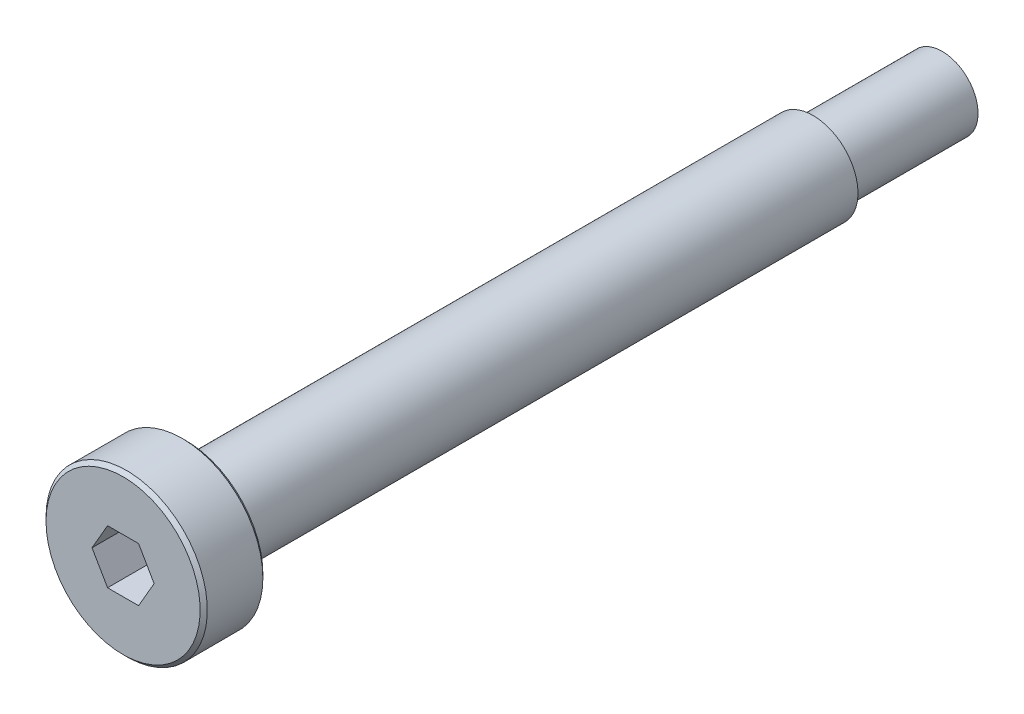
ISO-10303-21;
HEADER;
FILE_DESCRIPTION(('STEP AP214'),'2;1');
FILE_NAME('part.step','',(''),(''),'','','');
FILE_SCHEMA(('AUTOMOTIVE_DESIGN { 1 0 10303 214 1 1 1 1 }'));
ENDSEC;
DATA;
#1=APPLICATION_CONTEXT('core data for automotive mechanical design processes');
#2=APPLICATION_PROTOCOL_DEFINITION('international standard','automotive_design',2000,#1);
#3=PRODUCT_CONTEXT('',#1,'mechanical');
#4=PRODUCT('Part','Part','',(#3));
#5=PRODUCT_RELATED_PRODUCT_CATEGORY('part','',(#4));
#6=PRODUCT_DEFINITION_FORMATION('','',#4);
#7=PRODUCT_DEFINITION_CONTEXT('part definition',#1,'design');
#8=PRODUCT_DEFINITION('design','',#6,#7);
#9=PRODUCT_DEFINITION_SHAPE('','',#8);
#10=(LENGTH_UNIT() NAMED_UNIT(*) SI_UNIT(.MILLI.,.METRE.));
#11=(NAMED_UNIT(*) PLANE_ANGLE_UNIT() SI_UNIT($,.RADIAN.));
#12=(NAMED_UNIT(*) SI_UNIT($,.STERADIAN.) SOLID_ANGLE_UNIT());
#13=UNCERTAINTY_MEASURE_WITH_UNIT(LENGTH_MEASURE(1.E-05),#10,'distance_accuracy_value','');
#14=(GEOMETRIC_REPRESENTATION_CONTEXT(3) GLOBAL_UNCERTAINTY_ASSIGNED_CONTEXT((#13)) GLOBAL_UNIT_ASSIGNED_CONTEXT((#10,
#11,#12)) REPRESENTATION_CONTEXT('',''));
#15=CARTESIAN_POINT('',(0.,0.,0.));
#16=DIRECTION('',(0.,0.,1.));
#17=DIRECTION('',(1.,0.,0.));
#18=AXIS2_PLACEMENT_3D('',#15,#16,#17);
#19=CARTESIAN_POINT('',(0.,0.,0.));
#20=DIRECTION('',(0.,0.,-1.));
#21=DIRECTION('',(-1.,0.,0.));
#22=AXIS2_PLACEMENT_3D('',#19,#20,#21);
#23=PLANE('',#22);
#24=CARTESIAN_POINT('',(0.,0.,0.));
#25=DIRECTION('',(0.,0.,-1.));
#26=DIRECTION('',(-1.,0.,0.));
#27=AXIS2_PLACEMENT_3D('',#24,#25,#26);
#28=CIRCLE('',#27,4.29999999999999);
#29=CARTESIAN_POINT('',(-4.29999999999999,0.,0.));
#30=VERTEX_POINT('',#29);
#31=EDGE_CURVE('E11',#30,#30,#28,.F.);
#32=ORIENTED_EDGE('',*,*,#31,.T.);
#33=EDGE_LOOP('',(#32));
#34=FACE_BOUND('',#33,.T.);
#35=DIRECTION('',(-0.5,0.866025403784438,0.));
#36=VECTOR('',#35,1.);
#37=CARTESIAN_POINT('',(1.73205080756888,0.,0.));
#38=LINE('',#37,#36);
#39=CARTESIAN_POINT('',(1.73205080756888,0.,0.));
#40=VERTEX_POINT('',#39);
#41=CARTESIAN_POINT('',(0.866025403784438,1.5,0.));
#42=VERTEX_POINT('',#41);
#43=EDGE_CURVE('E140',#40,#42,#38,.T.);
#44=ORIENTED_EDGE('',*,*,#43,.F.);
#45=DIRECTION('',(0.5,0.866025403784439,0.));
#46=VECTOR('',#45,1.);
#47=CARTESIAN_POINT('',(0.86602540378444,-1.5,0.));
#48=LINE('',#47,#46);
#49=CARTESIAN_POINT('',(0.86602540378444,-1.5,0.));
#50=VERTEX_POINT('',#49);
#51=EDGE_CURVE('E66',#50,#40,#48,.T.);
#52=ORIENTED_EDGE('',*,*,#51,.F.);
#53=DIRECTION('',(1.,0.,0.));
#54=VECTOR('',#53,1.);
#55=CARTESIAN_POINT('',(-0.866025403784438,-1.5,0.));
#56=LINE('',#55,#54);
#57=CARTESIAN_POINT('',(-0.866025403784438,-1.5,0.));
#58=VERTEX_POINT('',#57);
#59=EDGE_CURVE('E149',#58,#50,#56,.T.);
#60=ORIENTED_EDGE('',*,*,#59,.F.);
#61=DIRECTION('',(0.5,-0.866025403784439,0.));
#62=VECTOR('',#61,1.);
#63=CARTESIAN_POINT('',(-1.73205080756888,0.,0.));
#64=LINE('',#63,#62);
#65=CARTESIAN_POINT('',(-1.73205080756888,0.,0.));
#66=VERTEX_POINT('',#65);
#67=EDGE_CURVE('E147',#66,#58,#64,.T.);
#68=ORIENTED_EDGE('',*,*,#67,.F.);
#69=DIRECTION('',(-0.5,-0.866025403784439,0.));
#70=VECTOR('',#69,1.);
#71=CARTESIAN_POINT('',(-0.866025403784439,1.5,0.));
#72=LINE('',#71,#70);
#73=CARTESIAN_POINT('',(-0.866025403784439,1.5,0.));
#74=VERTEX_POINT('',#73);
#75=EDGE_CURVE('E114',#74,#66,#72,.T.);
#76=ORIENTED_EDGE('',*,*,#75,.F.);
#77=DIRECTION('',(-1.,0.,0.));
#78=VECTOR('',#77,1.);
#79=CARTESIAN_POINT('',(0.866025403784438,1.5,0.));
#80=LINE('',#79,#78);
#81=EDGE_CURVE('E143',#42,#74,#80,.T.);
#82=ORIENTED_EDGE('',*,*,#81,.F.);
#83=EDGE_LOOP('',(#44,#52,#60,#68,#76,#82));
#84=FACE_BOUND('',#83,.T.);
#85=ADVANCED_FACE('F50',(#34,#84),#23,.F.);
#86=CARTESIAN_POINT('',(0.,0.,-45.7));
#87=DIRECTION('',(0.,0.,-1.));
#88=DIRECTION('',(-1.,0.,0.));
#89=AXIS2_PLACEMENT_3D('',#86,#87,#88);
#90=CYLINDRICAL_SURFACE('',#89,4.5);
#91=CARTESIAN_POINT('',(0.,0.,-3.3));
#92=DIRECTION('',(0.,0.,1.));
#93=DIRECTION('',(1.,0.,0.));
#94=AXIS2_PLACEMENT_3D('',#91,#92,#93);
#95=CIRCLE('',#94,4.5);
#96=CARTESIAN_POINT('',(4.5,0.,-3.3));
#97=VERTEX_POINT('',#96);
#98=EDGE_CURVE('E59',#97,#97,#95,.T.);
#99=ORIENTED_EDGE('',*,*,#98,.T.);
#100=EDGE_LOOP('',(#99));
#101=FACE_BOUND('',#100,.T.);
#102=CARTESIAN_POINT('',(0.,0.,-0.200000000000013));
#103=DIRECTION('',(0.,0.,-1.));
#104=DIRECTION('',(-1.,0.,0.));
#105=AXIS2_PLACEMENT_3D('',#102,#103,#104);
#106=CIRCLE('',#105,4.5);
#107=CARTESIAN_POINT('',(-4.5,0.,-0.200000000000013));
#108=VERTEX_POINT('',#107);
#109=EDGE_CURVE('E173',#108,#108,#106,.T.);
#110=ORIENTED_EDGE('',*,*,#109,.T.);
#111=EDGE_LOOP('',(#110));
#112=FACE_BOUND('',#111,.T.);
#113=ADVANCED_FACE('F178',(#101,#112),#90,.T.);
#114=CARTESIAN_POINT('',(0.,-4.5,-3.5));
#115=DIRECTION('',(0.,0.,1.));
#116=DIRECTION('',(1.,0.,0.));
#117=AXIS2_PLACEMENT_3D('',#114,#115,#116);
#118=PLANE('',#117);
#119=CARTESIAN_POINT('',(0.,0.,-3.5));
#120=DIRECTION('',(0.,0.,1.));
#121=DIRECTION('',(1.,0.,0.));
#122=AXIS2_PLACEMENT_3D('',#119,#120,#121);
#123=CIRCLE('',#122,4.3);
#124=CARTESIAN_POINT('',(4.3,0.,-3.5));
#125=VERTEX_POINT('',#124);
#126=EDGE_CURVE('E170',#125,#125,#123,.F.);
#127=ORIENTED_EDGE('',*,*,#126,.T.);
#128=EDGE_LOOP('',(#127));
#129=FACE_BOUND('',#128,.T.);
#130=CARTESIAN_POINT('',(0.,0.,-3.5));
#131=DIRECTION('',(0.,0.,-1.));
#132=DIRECTION('',(-1.,0.,0.));
#133=AXIS2_PLACEMENT_3D('',#130,#131,#132);
#134=CIRCLE('',#133,2.5);
#135=CARTESIAN_POINT('',(-2.5,0.,-3.5));
#136=VERTEX_POINT('',#135);
#137=EDGE_CURVE('E167',#136,#136,#134,.T.);
#138=ORIENTED_EDGE('',*,*,#137,.F.);
#139=EDGE_LOOP('',(#138));
#140=FACE_BOUND('',#139,.T.);
#141=ADVANCED_FACE('F186',(#129,#140),#118,.F.);
#142=CARTESIAN_POINT('',(0.,0.,-45.7));
#143=DIRECTION('',(0.,0.,-1.));
#144=DIRECTION('',(-1.,0.,0.));
#145=AXIS2_PLACEMENT_3D('',#142,#143,#144);
#146=CYLINDRICAL_SURFACE('',#145,2.5);
#147=CARTESIAN_POINT('',(0.,0.,-38.5));
#148=DIRECTION('',(0.,0.,-1.));
#149=DIRECTION('',(-1.,0.,0.));
#150=AXIS2_PLACEMENT_3D('',#147,#148,#149);
#151=CIRCLE('',#150,2.5);
#152=CARTESIAN_POINT('',(-2.5,0.,-38.5));
#153=VERTEX_POINT('',#152);
#154=EDGE_CURVE('E164',#153,#153,#151,.T.);
#155=ORIENTED_EDGE('',*,*,#154,.F.);
#156=EDGE_LOOP('',(#155));
#157=FACE_BOUND('',#156,.T.);
#158=ORIENTED_EDGE('',*,*,#137,.T.);
#159=EDGE_LOOP('',(#158));
#160=FACE_BOUND('',#159,.T.);
#161=ADVANCED_FACE('F189',(#157,#160),#146,.T.);
#162=CARTESIAN_POINT('',(0.,-2.5,-38.5));
#163=DIRECTION('',(0.,0.,1.));
#164=DIRECTION('',(1.,0.,0.));
#165=AXIS2_PLACEMENT_3D('',#162,#163,#164);
#166=PLANE('',#165);
#167=CARTESIAN_POINT('',(0.,0.,-38.5));
#168=DIRECTION('',(0.,0.,-1.));
#169=DIRECTION('',(-1.,0.,0.));
#170=AXIS2_PLACEMENT_3D('',#167,#168,#169);
#171=CIRCLE('',#170,2.);
#172=CARTESIAN_POINT('',(-2.,0.,-38.5));
#173=VERTEX_POINT('',#172);
#174=EDGE_CURVE('E161',#173,#173,#171,.T.);
#175=ORIENTED_EDGE('',*,*,#174,.F.);
#176=EDGE_LOOP('',(#175));
#177=FACE_BOUND('',#176,.T.);
#178=ORIENTED_EDGE('',*,*,#154,.T.);
#179=EDGE_LOOP('',(#178));
#180=FACE_BOUND('',#179,.T.);
#181=ADVANCED_FACE('F194',(#177,#180),#166,.F.);
#182=CARTESIAN_POINT('',(0.,0.,-45.7));
#183=DIRECTION('',(0.,0.,-1.));
#184=DIRECTION('',(-1.,0.,0.));
#185=AXIS2_PLACEMENT_3D('',#182,#183,#184);
#186=CYLINDRICAL_SURFACE('',#185,2.);
#187=CARTESIAN_POINT('',(0.,0.,-45.7));
#188=DIRECTION('',(0.,0.,-1.));
#189=DIRECTION('',(-1.,0.,0.));
#190=AXIS2_PLACEMENT_3D('',#187,#188,#189);
#191=CIRCLE('',#190,2.);
#192=CARTESIAN_POINT('',(-2.,0.,-45.7));
#193=VERTEX_POINT('',#192);
#194=EDGE_CURVE('E153',#193,#193,#191,.T.);
#195=ORIENTED_EDGE('',*,*,#194,.F.);
#196=EDGE_LOOP('',(#195));
#197=FACE_BOUND('',#196,.T.);
#198=ORIENTED_EDGE('',*,*,#174,.T.);
#199=EDGE_LOOP('',(#198));
#200=FACE_BOUND('',#199,.T.);
#201=ADVANCED_FACE('F200',(#197,#200),#186,.T.);
#202=CARTESIAN_POINT('',(0.,-2.,-45.7));
#203=DIRECTION('',(0.,0.,1.));
#204=DIRECTION('',(1.,0.,0.));
#205=AXIS2_PLACEMENT_3D('',#202,#203,#204);
#206=PLANE('',#205);
#207=ORIENTED_EDGE('',*,*,#194,.T.);
#208=EDGE_LOOP('',(#207));
#209=FACE_BOUND('',#208,.T.);
#210=ADVANCED_FACE('F228',(#209),#206,.F.);
#211=CARTESIAN_POINT('',(0.86602540378444,-1.5,-3.));
#212=DIRECTION('',(0.866025403784439,-0.5,0.));
#213=DIRECTION('',(0.5,0.866025403784439,0.));
#214=AXIS2_PLACEMENT_3D('',#211,#212,#213);
#215=PLANE('',#214);
#216=ORIENTED_EDGE('',*,*,#51,.T.);
#217=DIRECTION('',(0.,0.,1.));
#218=VECTOR('',#217,1.);
#219=CARTESIAN_POINT('',(1.73205080756888,0.,-3.));
#220=LINE('',#219,#218);
#221=CARTESIAN_POINT('',(1.73205080756888,0.,-3.));
#222=VERTEX_POINT('',#221);
#223=EDGE_CURVE('E96',#222,#40,#220,.T.);
#224=ORIENTED_EDGE('',*,*,#223,.F.);
#225=DIRECTION('',(0.5,0.866025403784439,0.));
#226=VECTOR('',#225,1.);
#227=CARTESIAN_POINT('',(0.86602540378444,-1.5,-3.));
#228=LINE('',#227,#226);
#229=CARTESIAN_POINT('',(0.86602540378444,-1.5,-3.));
#230=VERTEX_POINT('',#229);
#231=EDGE_CURVE('E151',#230,#222,#228,.T.);
#232=ORIENTED_EDGE('',*,*,#231,.F.);
#233=DIRECTION('',(0.,0.,1.));
#234=VECTOR('',#233,1.);
#235=CARTESIAN_POINT('',(0.86602540378444,-1.5,-3.));
#236=LINE('',#235,#234);
#237=EDGE_CURVE('E74',#230,#50,#236,.T.);
#238=ORIENTED_EDGE('',*,*,#237,.T.);
#239=EDGE_LOOP('',(#216,#224,#232,#238));
#240=FACE_BOUND('',#239,.T.);
#241=ADVANCED_FACE('F225',(#240),#215,.F.);
#242=CARTESIAN_POINT('',(-0.866025403784438,-1.5,-3.));
#243=DIRECTION('',(0.,-1.,0.));
#244=DIRECTION('',(0.,0.,-1.));
#245=AXIS2_PLACEMENT_3D('',#242,#243,#244);
#246=PLANE('',#245);
#247=ORIENTED_EDGE('',*,*,#59,.T.);
#248=ORIENTED_EDGE('',*,*,#237,.F.);
#249=DIRECTION('',(1.,0.,0.));
#250=VECTOR('',#249,1.);
#251=CARTESIAN_POINT('',(-0.866025403784438,-1.5,-3.));
#252=LINE('',#251,#250);
#253=CARTESIAN_POINT('',(-0.866025403784438,-1.5,-3.));
#254=VERTEX_POINT('',#253);
#255=EDGE_CURVE('E126',#254,#230,#252,.T.);
#256=ORIENTED_EDGE('',*,*,#255,.F.);
#257=DIRECTION('',(0.,0.,1.));
#258=VECTOR('',#257,1.);
#259=CARTESIAN_POINT('',(-0.866025403784438,-1.5,-3.));
#260=LINE('',#259,#258);
#261=EDGE_CURVE('E118',#254,#58,#260,.T.);
#262=ORIENTED_EDGE('',*,*,#261,.T.);
#263=EDGE_LOOP('',(#247,#248,#256,#262));
#264=FACE_BOUND('',#263,.T.);
#265=ADVANCED_FACE('F227',(#264),#246,.F.);
#266=CARTESIAN_POINT('',(-1.73205080756888,0.,-3.));
#267=DIRECTION('',(-0.866025403784439,-0.5,0.));
#268=DIRECTION('',(0.5,-0.866025403784439,0.));
#269=AXIS2_PLACEMENT_3D('',#266,#267,#268);
#270=PLANE('',#269);
#271=ORIENTED_EDGE('',*,*,#67,.T.);
#272=ORIENTED_EDGE('',*,*,#261,.F.);
#273=DIRECTION('',(0.5,-0.866025403784439,0.));
#274=VECTOR('',#273,1.);
#275=CARTESIAN_POINT('',(-1.73205080756888,0.,-3.));
#276=LINE('',#275,#274);
#277=CARTESIAN_POINT('',(-1.73205080756888,0.,-3.));
#278=VERTEX_POINT('',#277);
#279=EDGE_CURVE('E122',#278,#254,#276,.T.);
#280=ORIENTED_EDGE('',*,*,#279,.F.);
#281=DIRECTION('',(0.,0.,1.));
#282=VECTOR('',#281,1.);
#283=CARTESIAN_POINT('',(-1.73205080756888,0.,-3.));
#284=LINE('',#283,#282);
#285=EDGE_CURVE('E107',#278,#66,#284,.T.);
#286=ORIENTED_EDGE('',*,*,#285,.T.);
#287=EDGE_LOOP('',(#271,#272,#280,#286));
#288=FACE_BOUND('',#287,.T.);
#289=ADVANCED_FACE('F123',(#288),#270,.F.);
#290=CARTESIAN_POINT('',(-0.866025403784439,1.5,-3.));
#291=DIRECTION('',(-0.866025403784439,0.5,0.));
#292=DIRECTION('',(-0.5,-0.866025403784439,0.));
#293=AXIS2_PLACEMENT_3D('',#290,#291,#292);
#294=PLANE('',#293);
#295=ORIENTED_EDGE('',*,*,#75,.T.);
#296=ORIENTED_EDGE('',*,*,#285,.F.);
#297=DIRECTION('',(-0.5,-0.866025403784439,0.));
#298=VECTOR('',#297,1.);
#299=CARTESIAN_POINT('',(-0.866025403784439,1.5,-3.));
#300=LINE('',#299,#298);
#301=CARTESIAN_POINT('',(-0.866025403784439,1.5,-3.));
#302=VERTEX_POINT('',#301);
#303=EDGE_CURVE('E111',#302,#278,#300,.T.);
#304=ORIENTED_EDGE('',*,*,#303,.F.);
#305=DIRECTION('',(0.,0.,1.));
#306=VECTOR('',#305,1.);
#307=CARTESIAN_POINT('',(-0.866025403784439,1.5,-3.));
#308=LINE('',#307,#306);
#309=EDGE_CURVE('E119',#302,#74,#308,.T.);
#310=ORIENTED_EDGE('',*,*,#309,.T.);
#311=EDGE_LOOP('',(#295,#296,#304,#310));
#312=FACE_BOUND('',#311,.T.);
#313=ADVANCED_FACE('F109',(#312),#294,.F.);
#314=CARTESIAN_POINT('',(0.866025403784438,1.5,-3.));
#315=DIRECTION('',(0.,1.,0.));
#316=DIRECTION('',(-1.,0.,0.));
#317=AXIS2_PLACEMENT_3D('',#314,#315,#316);
#318=PLANE('',#317);
#319=ORIENTED_EDGE('',*,*,#81,.T.);
#320=ORIENTED_EDGE('',*,*,#309,.F.);
#321=DIRECTION('',(-1.,0.,0.));
#322=VECTOR('',#321,1.);
#323=CARTESIAN_POINT('',(0.866025403784438,1.5,-3.));
#324=LINE('',#323,#322);
#325=CARTESIAN_POINT('',(0.866025403784438,1.5,-3.));
#326=VERTEX_POINT('',#325);
#327=EDGE_CURVE('E132',#326,#302,#324,.T.);
#328=ORIENTED_EDGE('',*,*,#327,.F.);
#329=DIRECTION('',(0.,0.,1.));
#330=VECTOR('',#329,1.);
#331=CARTESIAN_POINT('',(0.866025403784438,1.5,-3.));
#332=LINE('',#331,#330);
#333=EDGE_CURVE('E156',#326,#42,#332,.T.);
#334=ORIENTED_EDGE('',*,*,#333,.T.);
#335=EDGE_LOOP('',(#319,#320,#328,#334));
#336=FACE_BOUND('',#335,.T.);
#337=ADVANCED_FACE('F289',(#336),#318,.F.);
#338=CARTESIAN_POINT('',(1.73205080756888,0.,-3.));
#339=DIRECTION('',(0.866025403784438,0.5,0.));
#340=DIRECTION('',(-0.5,0.866025403784439,0.));
#341=AXIS2_PLACEMENT_3D('',#338,#339,#340);
#342=PLANE('',#341);
#343=ORIENTED_EDGE('',*,*,#43,.T.);
#344=ORIENTED_EDGE('',*,*,#333,.F.);
#345=DIRECTION('',(-0.5,0.866025403784438,0.));
#346=VECTOR('',#345,1.);
#347=CARTESIAN_POINT('',(1.73205080756888,0.,-3.));
#348=LINE('',#347,#346);
#349=EDGE_CURVE('E134',#222,#326,#348,.T.);
#350=ORIENTED_EDGE('',*,*,#349,.F.);
#351=ORIENTED_EDGE('',*,*,#223,.T.);
#352=EDGE_LOOP('',(#343,#344,#350,#351));
#353=FACE_BOUND('',#352,.T.);
#354=ADVANCED_FACE('F223',(#353),#342,.F.);
#355=CARTESIAN_POINT('',(0.,0.,-3.));
#356=DIRECTION('',(0.,0.,1.));
#357=DIRECTION('',(1.,0.,0.));
#358=AXIS2_PLACEMENT_3D('',#355,#356,#357);
#359=PLANE('',#358);
#360=ORIENTED_EDGE('',*,*,#231,.T.);
#361=ORIENTED_EDGE('',*,*,#349,.T.);
#362=ORIENTED_EDGE('',*,*,#327,.T.);
#363=ORIENTED_EDGE('',*,*,#303,.T.);
#364=ORIENTED_EDGE('',*,*,#279,.T.);
#365=ORIENTED_EDGE('',*,*,#255,.T.);
#366=EDGE_LOOP('',(#360,#361,#362,#363,#364,#365));
#367=FACE_BOUND('',#366,.T.);
#368=ADVANCED_FACE('F129',(#367),#359,.T.);
#369=CARTESIAN_POINT('',(0.,0.,-3.5));
#370=DIRECTION('',(0.,0.,1.));
#371=DIRECTION('',(1.,0.,0.));
#372=AXIS2_PLACEMENT_3D('',#369,#370,#371);
#373=CONICAL_SURFACE('',#372,4.3,0.785398163397455);
#374=ORIENTED_EDGE('',*,*,#98,.F.);
#375=EDGE_LOOP('',(#374));
#376=FACE_BOUND('',#375,.T.);
#377=ORIENTED_EDGE('',*,*,#126,.F.);
#378=EDGE_LOOP('',(#377));
#379=FACE_BOUND('',#378,.T.);
#380=ADVANCED_FACE('F181',(#376,#379),#373,.T.);
#381=CARTESIAN_POINT('',(0.,0.,-0.200000000000013));
#382=DIRECTION('',(0.,0.,-1.));
#383=DIRECTION('',(-1.,0.,0.));
#384=AXIS2_PLACEMENT_3D('',#381,#382,#383);
#385=CONICAL_SURFACE('',#384,4.5,0.785398163397438);
#386=ORIENTED_EDGE('',*,*,#31,.F.);
#387=EDGE_LOOP('',(#386));
#388=FACE_BOUND('',#387,.T.);
#389=ORIENTED_EDGE('',*,*,#109,.F.);
#390=EDGE_LOOP('',(#389));
#391=FACE_BOUND('',#390,.T.);
#392=ADVANCED_FACE('F53',(#388,#391),#385,.T.);
#393=CLOSED_SHELL('',(#85,#113,#141,#161,#181,#201,#210,#241,#265,#289,#313,#337,#354,#368,#380,#392));
#394=MANIFOLD_SOLID_BREP('B2',#393);
#395=ADVANCED_BREP_SHAPE_REPRESENTATION('',(#18,#394),#14);
#396=SHAPE_DEFINITION_REPRESENTATION(#9,#395);
ENDSEC;
END-ISO-10303-21;
